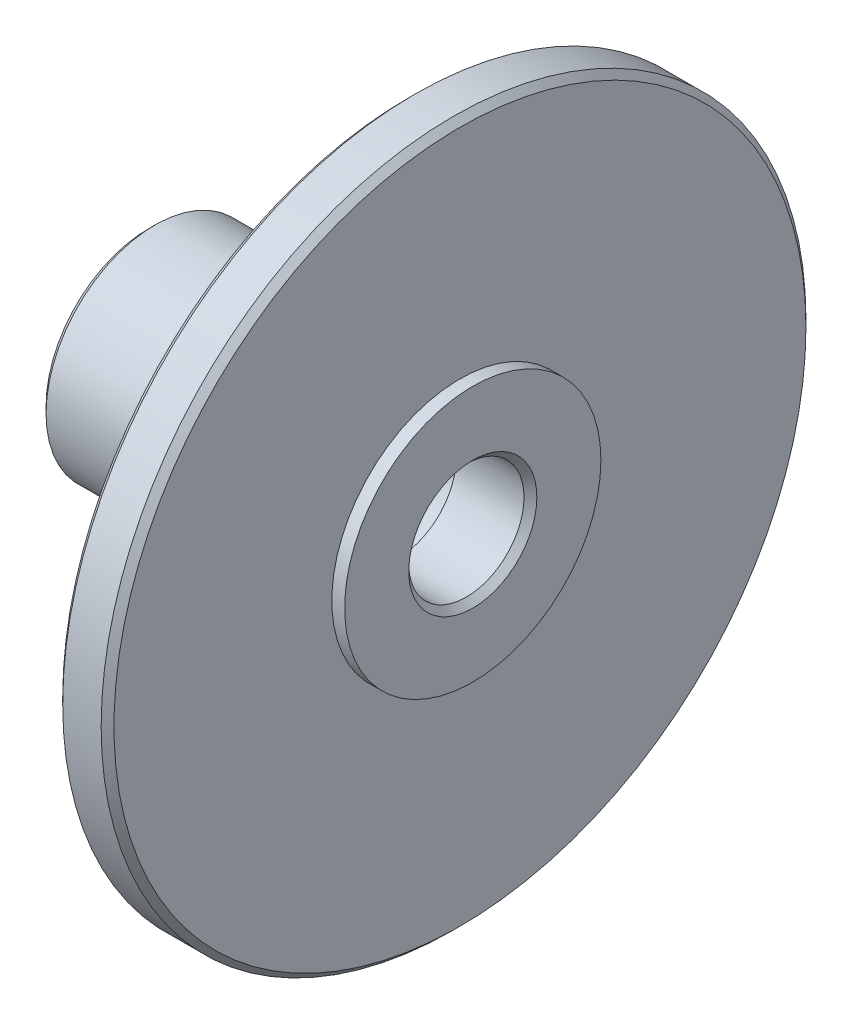
ISO-10303-21;
HEADER;
FILE_DESCRIPTION(('STEP AP214'),'2;1');
FILE_NAME('part.step','',(''),(''),'','','');
FILE_SCHEMA(('AUTOMOTIVE_DESIGN { 1 0 10303 214 1 1 1 1 }'));
ENDSEC;
DATA;
#1=APPLICATION_CONTEXT('core data for automotive mechanical design processes');
#2=APPLICATION_PROTOCOL_DEFINITION('international standard','automotive_design',2000,#1);
#3=PRODUCT_CONTEXT('',#1,'mechanical');
#4=PRODUCT('Part','Part','',(#3));
#5=PRODUCT_RELATED_PRODUCT_CATEGORY('part','',(#4));
#6=PRODUCT_DEFINITION_FORMATION('','',#4);
#7=PRODUCT_DEFINITION_CONTEXT('part definition',#1,'design');
#8=PRODUCT_DEFINITION('design','',#6,#7);
#9=PRODUCT_DEFINITION_SHAPE('','',#8);
#10=(LENGTH_UNIT() NAMED_UNIT(*) SI_UNIT(.MILLI.,.METRE.));
#11=(NAMED_UNIT(*) PLANE_ANGLE_UNIT() SI_UNIT($,.RADIAN.));
#12=(NAMED_UNIT(*) SI_UNIT($,.STERADIAN.) SOLID_ANGLE_UNIT());
#13=UNCERTAINTY_MEASURE_WITH_UNIT(LENGTH_MEASURE(1.E-05),#10,'distance_accuracy_value','');
#14=(GEOMETRIC_REPRESENTATION_CONTEXT(3) GLOBAL_UNCERTAINTY_ASSIGNED_CONTEXT((#13)) GLOBAL_UNIT_ASSIGNED_CONTEXT((#10,
#11,#12)) REPRESENTATION_CONTEXT('',''));
#15=CARTESIAN_POINT('',(0.,0.,0.));
#16=DIRECTION('',(0.,0.,1.));
#17=DIRECTION('',(1.,0.,0.));
#18=AXIS2_PLACEMENT_3D('',#15,#16,#17);
#19=CARTESIAN_POINT('',(184.6,-26.5,216.5));
#20=DIRECTION('',(-1.,0.,0.));
#21=DIRECTION('',(0.,0.,1.));
#22=AXIS2_PLACEMENT_3D('',#19,#20,#21);
#23=CYLINDRICAL_SURFACE('',#22,27.5);
#24=CARTESIAN_POINT('',(184.099999999998,-26.5,216.5));
#25=DIRECTION('',(1.,0.,0.));
#26=DIRECTION('',(0.,0.,-1.));
#27=AXIS2_PLACEMENT_3D('',#24,#25,#26);
#28=CIRCLE('',#27,27.5);
#29=CARTESIAN_POINT('',(184.099999999998,-26.5,189.));
#30=VERTEX_POINT('',#29);
#31=EDGE_CURVE('E313',#30,#30,#28,.F.);
#32=ORIENTED_EDGE('',*,*,#31,.T.);
#33=EDGE_LOOP('',(#32));
#34=FACE_BOUND('',#33,.T.);
#35=CARTESIAN_POINT('',(181.100000000002,-26.5,216.5));
#36=DIRECTION('',(-1.,0.,0.));
#37=DIRECTION('',(0.,0.,1.));
#38=AXIS2_PLACEMENT_3D('',#35,#36,#37);
#39=CIRCLE('',#38,27.5);
#40=CARTESIAN_POINT('',(181.100000000002,-26.5,244.));
#41=VERTEX_POINT('',#40);
#42=EDGE_CURVE('E144',#41,#41,#39,.F.);
#43=ORIENTED_EDGE('',*,*,#42,.T.);
#44=EDGE_LOOP('',(#43));
#45=FACE_BOUND('',#44,.T.);
#46=ADVANCED_FACE('F41',(#34,#45),#23,.T.);
#47=CARTESIAN_POINT('',(184.6,1.,216.5));
#48=DIRECTION('',(1.,0.,0.));
#49=DIRECTION('',(0.,0.,-1.));
#50=AXIS2_PLACEMENT_3D('',#47,#48,#49);
#51=PLANE('',#50);
#52=CARTESIAN_POINT('',(184.6,-26.5,216.5));
#53=DIRECTION('',(1.,0.,0.));
#54=DIRECTION('',(0.,0.,-1.));
#55=AXIS2_PLACEMENT_3D('',#52,#53,#54);
#56=CIRCLE('',#55,26.9999999999984);
#57=CARTESIAN_POINT('',(184.6,-26.5,189.500000000002));
#58=VERTEX_POINT('',#57);
#59=EDGE_CURVE('E316',#58,#58,#56,.T.);
#60=ORIENTED_EDGE('',*,*,#59,.T.);
#61=EDGE_LOOP('',(#60));
#62=FACE_BOUND('',#61,.T.);
#63=CARTESIAN_POINT('',(184.6,-26.5,216.5));
#64=DIRECTION('',(1.,0.,0.));
#65=DIRECTION('',(0.,0.,-1.));
#66=AXIS2_PLACEMENT_3D('',#63,#64,#65);
#67=CIRCLE('',#66,10.);
#68=CARTESIAN_POINT('',(184.6,-26.5,206.5));
#69=VERTEX_POINT('',#68);
#70=EDGE_CURVE('E297',#69,#69,#67,.T.);
#71=ORIENTED_EDGE('',*,*,#70,.F.);
#72=EDGE_LOOP('',(#71));
#73=FACE_BOUND('',#72,.T.);
#74=ADVANCED_FACE('F202',(#62,#73),#51,.T.);
#75=CARTESIAN_POINT('',(180.6,-26.5,216.5));
#76=DIRECTION('',(-1.,0.,0.));
#77=DIRECTION('',(0.,0.,1.));
#78=AXIS2_PLACEMENT_3D('',#75,#76,#77);
#79=PLANE('',#78);
#80=CARTESIAN_POINT('',(180.6,-26.5,216.5));
#81=DIRECTION('',(-1.,0.,0.));
#82=DIRECTION('',(0.,0.,1.));
#83=AXIS2_PLACEMENT_3D('',#80,#81,#82);
#84=CIRCLE('',#83,13.5);
#85=CARTESIAN_POINT('',(180.6,-26.5,230.));
#86=VERTEX_POINT('',#85);
#87=EDGE_CURVE('E11',#86,#86,#84,.F.);
#88=ORIENTED_EDGE('',*,*,#87,.T.);
#89=EDGE_LOOP('',(#88));
#90=FACE_BOUND('',#89,.T.);
#91=CARTESIAN_POINT('',(180.6,-26.5,216.5));
#92=DIRECTION('',(-1.,0.,0.));
#93=DIRECTION('',(0.,0.,1.));
#94=AXIS2_PLACEMENT_3D('',#91,#92,#93);
#95=CIRCLE('',#94,26.9999999999984);
#96=CARTESIAN_POINT('',(180.6,-26.5,243.499999999998));
#97=VERTEX_POINT('',#96);
#98=EDGE_CURVE('E328',#97,#97,#95,.T.);
#99=ORIENTED_EDGE('',*,*,#98,.T.);
#100=EDGE_LOOP('',(#99));
#101=FACE_BOUND('',#100,.T.);
#102=ADVANCED_FACE('F208',(#90,#101),#79,.T.);
#103=CARTESIAN_POINT('',(185.6,-26.5,216.5));
#104=DIRECTION('',(-1.,0.,0.));
#105=DIRECTION('',(0.,0.,1.));
#106=AXIS2_PLACEMENT_3D('',#103,#104,#105);
#107=CYLINDRICAL_SURFACE('',#106,10.);
#108=CARTESIAN_POINT('',(185.6,-26.5,216.5));
#109=DIRECTION('',(1.,0.,0.));
#110=DIRECTION('',(0.,0.,-1.));
#111=AXIS2_PLACEMENT_3D('',#108,#109,#110);
#112=CIRCLE('',#111,10.);
#113=CARTESIAN_POINT('',(185.6,-26.5,206.5));
#114=VERTEX_POINT('',#113);
#115=EDGE_CURVE('E301',#114,#114,#112,.T.);
#116=ORIENTED_EDGE('',*,*,#115,.F.);
#117=EDGE_LOOP('',(#116));
#118=FACE_BOUND('',#117,.T.);
#119=ORIENTED_EDGE('',*,*,#70,.T.);
#120=EDGE_LOOP('',(#119));
#121=FACE_BOUND('',#120,.T.);
#122=ADVANCED_FACE('F393',(#118,#121),#107,.T.);
#123=CARTESIAN_POINT('',(185.6,-26.5,216.5));
#124=DIRECTION('',(1.,0.,0.));
#125=DIRECTION('',(0.,0.,-1.));
#126=AXIS2_PLACEMENT_3D('',#123,#124,#125);
#127=PLANE('',#126);
#128=CARTESIAN_POINT('',(185.6,-26.5,216.5));
#129=DIRECTION('',(1.,0.,0.));
#130=DIRECTION('',(0.,0.,-1.));
#131=AXIS2_PLACEMENT_3D('',#128,#129,#130);
#132=CIRCLE('',#131,5.00000000000161);
#133=CARTESIAN_POINT('',(185.6,-26.5,211.499999999998));
#134=VERTEX_POINT('',#133);
#135=EDGE_CURVE('E324',#134,#134,#132,.F.);
#136=ORIENTED_EDGE('',*,*,#135,.T.);
#137=EDGE_LOOP('',(#136));
#138=FACE_BOUND('',#137,.T.);
#139=ORIENTED_EDGE('',*,*,#115,.T.);
#140=EDGE_LOOP('',(#139));
#141=FACE_BOUND('',#140,.T.);
#142=ADVANCED_FACE('F390',(#138,#141),#127,.T.);
#143=CARTESIAN_POINT('',(172.5,-26.5,216.5));
#144=DIRECTION('',(1.,0.,0.));
#145=DIRECTION('',(0.,0.,-1.));
#146=AXIS2_PLACEMENT_3D('',#143,#144,#145);
#147=CYLINDRICAL_SURFACE('',#146,9.50000000000001);
#148=CARTESIAN_POINT('',(176.6,-26.5,216.5));
#149=DIRECTION('',(-1.,0.,0.));
#150=DIRECTION('',(0.,0.,1.));
#151=AXIS2_PLACEMENT_3D('',#148,#149,#150);
#152=CIRCLE('',#151,9.50000000000001);
#153=CARTESIAN_POINT('',(176.6,-26.5,226.));
#154=VERTEX_POINT('',#153);
#155=EDGE_CURVE('E50',#154,#154,#152,.T.);
#156=ORIENTED_EDGE('',*,*,#155,.T.);
#157=EDGE_LOOP('',(#156));
#158=FACE_BOUND('',#157,.T.);
#159=CARTESIAN_POINT('',(172.5,-26.5,216.5));
#160=DIRECTION('',(-1.,0.,0.));
#161=DIRECTION('',(0.,0.,1.));
#162=AXIS2_PLACEMENT_3D('',#159,#160,#161);
#163=CIRCLE('',#162,9.50000000000001);
#164=CARTESIAN_POINT('',(172.5,-26.5,226.));
#165=VERTEX_POINT('',#164);
#166=EDGE_CURVE('E275',#165,#165,#163,.T.);
#167=ORIENTED_EDGE('',*,*,#166,.F.);
#168=EDGE_LOOP('',(#167));
#169=FACE_BOUND('',#168,.T.);
#170=ADVANCED_FACE('F189',(#158,#169),#147,.T.);
#171=CARTESIAN_POINT('',(172.5,-26.5,216.5));
#172=DIRECTION('',(-1.,0.,0.));
#173=DIRECTION('',(0.,0.,1.));
#174=AXIS2_PLACEMENT_3D('',#171,#172,#173);
#175=PLANE('',#174);
#176=CARTESIAN_POINT('',(172.5,-26.5,216.5));
#177=DIRECTION('',(-1.,0.,0.));
#178=DIRECTION('',(0.,0.,1.));
#179=AXIS2_PLACEMENT_3D('',#176,#177,#178);
#180=CIRCLE('',#179,8.49999999999999);
#181=CARTESIAN_POINT('',(172.5,-26.5,225.));
#182=VERTEX_POINT('',#181);
#183=EDGE_CURVE('E293',#182,#182,#180,.T.);
#184=ORIENTED_EDGE('',*,*,#183,.F.);
#185=EDGE_LOOP('',(#184));
#186=FACE_BOUND('',#185,.T.);
#187=ORIENTED_EDGE('',*,*,#166,.T.);
#188=EDGE_LOOP('',(#187));
#189=FACE_BOUND('',#188,.T.);
#190=ADVANCED_FACE('F380',(#186,#189),#175,.T.);
#191=CARTESIAN_POINT('',(160.3,-26.5,216.5));
#192=DIRECTION('',(1.,0.,0.));
#193=DIRECTION('',(0.,0.,-1.));
#194=AXIS2_PLACEMENT_3D('',#191,#192,#193);
#195=CYLINDRICAL_SURFACE('',#194,8.49999999999999);
#196=CARTESIAN_POINT('',(160.800000000002,-26.5,216.5));
#197=DIRECTION('',(-1.,0.,0.));
#198=DIRECTION('',(0.,0.,1.));
#199=AXIS2_PLACEMENT_3D('',#196,#197,#198);
#200=CIRCLE('',#199,8.49999999999999);
#201=CARTESIAN_POINT('',(160.800000000002,-26.5,225.));
#202=VERTEX_POINT('',#201);
#203=EDGE_CURVE('E134',#202,#202,#200,.F.);
#204=ORIENTED_EDGE('',*,*,#203,.T.);
#205=EDGE_LOOP('',(#204));
#206=FACE_BOUND('',#205,.T.);
#207=ORIENTED_EDGE('',*,*,#183,.T.);
#208=EDGE_LOOP('',(#207));
#209=FACE_BOUND('',#208,.T.);
#210=ADVANCED_FACE('F372',(#206,#209),#195,.T.);
#211=CARTESIAN_POINT('',(160.3,-26.5,216.5));
#212=DIRECTION('',(-1.,0.,0.));
#213=DIRECTION('',(0.,0.,1.));
#214=AXIS2_PLACEMENT_3D('',#211,#212,#213);
#215=PLANE('',#214);
#216=CARTESIAN_POINT('',(160.3,-26.5,216.5));
#217=DIRECTION('',(-1.,0.,0.));
#218=DIRECTION('',(0.,0.,1.));
#219=AXIS2_PLACEMENT_3D('',#216,#217,#218);
#220=CIRCLE('',#219,7.99999999999837);
#221=CARTESIAN_POINT('',(160.3,-26.5,224.499999999998));
#222=VERTEX_POINT('',#221);
#223=EDGE_CURVE('E332',#222,#222,#220,.T.);
#224=ORIENTED_EDGE('',*,*,#223,.T.);
#225=EDGE_LOOP('',(#224));
#226=FACE_BOUND('',#225,.T.);
#227=DIRECTION('',(0.,0.707106781186498,-0.707106781186597));
#228=VECTOR('',#227,1.);
#229=CARTESIAN_POINT('',(160.3,-25.2492286871601,220.906082936653));
#230=LINE('',#229,#228);
#231=CARTESIAN_POINT('',(160.3,-24.9196621947679,220.57651644426));
#232=VERTEX_POINT('',#231);
#233=CARTESIAN_POINT('',(160.3,-22.4234835557392,218.080337805231));
#234=VERTEX_POINT('',#233);
#235=EDGE_CURVE('E129',#232,#234,#230,.T.);
#236=ORIENTED_EDGE('',*,*,#235,.F.);
#237=CARTESIAN_POINT('',(160.3,-24.2125554135813,221.283623225447));
#238=DIRECTION('',(-1.,0.,0.));
#239=DIRECTION('',(0.,0.,1.));
#240=AXIS2_PLACEMENT_3D('',#237,#238,#239);
#241=CIRCLE('',#240,1.);
#242=CARTESIAN_POINT('',(160.3,-25.212386061891,221.265220108848));
#243=VERTEX_POINT('',#242);
#244=EDGE_CURVE('E350',#232,#243,#241,.T.);
#245=ORIENTED_EDGE('',*,*,#244,.T.);
#246=CARTESIAN_POINT('',(160.3,-26.7121320343556,221.23761543395));
#247=DIRECTION('',(-1.,0.,0.));
#248=DIRECTION('',(0.,0.,1.));
#249=AXIS2_PLACEMENT_3D('',#246,#247,#248);
#250=CIRCLE('',#249,1.5);
#251=CARTESIAN_POINT('',(160.3,-28.1592083672621,221.632545917379));
#252=VERTEX_POINT('',#251);
#253=EDGE_CURVE('E284',#252,#243,#250,.T.);
#254=ORIENTED_EDGE('',*,*,#253,.F.);
#255=CARTESIAN_POINT('',(160.3,-29.1239259225332,221.895832906332));
#256=DIRECTION('',(-1.,0.,0.));
#257=DIRECTION('',(0.,0.,1.));
#258=AXIS2_PLACEMENT_3D('',#255,#256,#257);
#259=CIRCLE('',#258,1.);
#260=CARTESIAN_POINT('',(160.3,-28.6866049354443,220.996527421944));
#261=VERTEX_POINT('',#260);
#262=EDGE_CURVE('E344',#252,#261,#259,.T.);
#263=ORIENTED_EDGE('',*,*,#262,.T.);
#264=CARTESIAN_POINT('',(160.3,-26.5,216.5));
#265=DIRECTION('',(-1.,0.,0.));
#266=DIRECTION('',(0.,0.,1.));
#267=AXIS2_PLACEMENT_3D('',#264,#265,#266);
#268=CIRCLE('',#267,5.00000000000001);
#269=CARTESIAN_POINT('',(160.3,-22.0034725780568,214.313395064555));
#270=VERTEX_POINT('',#269);
#271=EDGE_CURVE('E281',#270,#261,#268,.T.);
#272=ORIENTED_EDGE('',*,*,#271,.F.);
#273=CARTESIAN_POINT('',(160.3,-21.1041670936682,213.876074077466));
#274=DIRECTION('',(-1.,0.,0.));
#275=DIRECTION('',(0.,0.,1.));
#276=AXIS2_PLACEMENT_3D('',#273,#274,#275);
#277=CIRCLE('',#276,1.);
#278=CARTESIAN_POINT('',(160.3,-21.367454082621,214.840791632737));
#279=VERTEX_POINT('',#278);
#280=EDGE_CURVE('E341',#270,#279,#277,.T.);
#281=ORIENTED_EDGE('',*,*,#280,.T.);
#282=CARTESIAN_POINT('',(160.3,-21.7623845660502,216.287867965643));
#283=DIRECTION('',(-1.,0.,0.));
#284=DIRECTION('',(0.,0.,1.));
#285=AXIS2_PLACEMENT_3D('',#282,#283,#284);
#286=CIRCLE('',#285,1.49999999999999);
#287=CARTESIAN_POINT('',(160.3,-21.7347798911516,217.787613938108));
#288=VERTEX_POINT('',#287);
#289=EDGE_CURVE('E277',#288,#279,#286,.T.);
#290=ORIENTED_EDGE('',*,*,#289,.F.);
#291=CARTESIAN_POINT('',(160.3,-21.7163767745526,218.787444586418));
#292=DIRECTION('',(-1.,0.,0.));
#293=DIRECTION('',(0.,0.,1.));
#294=AXIS2_PLACEMENT_3D('',#291,#292,#293);
#295=CIRCLE('',#294,1.);
#296=EDGE_CURVE('E347',#288,#234,#295,.T.);
#297=ORIENTED_EDGE('',*,*,#296,.T.);
#298=EDGE_LOOP('',(#236,#245,#254,#263,#272,#281,#290,#297));
#299=FACE_BOUND('',#298,.T.);
#300=ADVANCED_FACE('F368',(#226,#299),#215,.T.);
#301=CARTESIAN_POINT('',(179.8,-26.5,216.5));
#302=DIRECTION('',(-1.,0.,0.));
#303=DIRECTION('',(0.,0.,1.));
#304=AXIS2_PLACEMENT_3D('',#301,#302,#303);
#305=CYLINDRICAL_SURFACE('',#304,5.00000000000001);
#306=ORIENTED_EDGE('',*,*,#271,.T.);
#307=DIRECTION('',(-1.,0.,0.));
#308=VECTOR('',#307,1.);
#309=CARTESIAN_POINT('',(179.8,-28.6866049354443,220.996527421944));
#310=LINE('',#309,#308);
#311=CARTESIAN_POINT('',(179.8,-28.6866049354443,220.996527421944));
#312=VERTEX_POINT('',#311);
#313=EDGE_CURVE('E57',#261,#312,#310,.F.);
#314=ORIENTED_EDGE('',*,*,#313,.T.);
#315=CARTESIAN_POINT('',(179.8,-26.5,216.5));
#316=DIRECTION('',(-1.,0.,0.));
#317=DIRECTION('',(0.,0.,1.));
#318=AXIS2_PLACEMENT_3D('',#315,#316,#317);
#319=CIRCLE('',#318,5.00000000000001);
#320=CARTESIAN_POINT('',(179.8,-22.0034725780568,214.313395064555));
#321=VERTEX_POINT('',#320);
#322=EDGE_CURVE('E263',#321,#312,#319,.T.);
#323=ORIENTED_EDGE('',*,*,#322,.F.);
#324=DIRECTION('',(-1.,0.,0.));
#325=VECTOR('',#324,1.);
#326=CARTESIAN_POINT('',(179.8,-22.0034725780568,214.313395064555));
#327=LINE('',#326,#325);
#328=EDGE_CURVE('E168',#321,#270,#327,.T.);
#329=ORIENTED_EDGE('',*,*,#328,.T.);
#330=EDGE_LOOP('',(#306,#314,#323,#329));
#331=FACE_BOUND('',#330,.T.);
#332=ADVANCED_FACE('F366',(#331),#305,.F.);
#333=CARTESIAN_POINT('',(179.8,-21.7623845660502,216.287867965643));
#334=DIRECTION('',(-1.,0.,0.));
#335=DIRECTION('',(0.,0.,1.));
#336=AXIS2_PLACEMENT_3D('',#333,#334,#335);
#337=CYLINDRICAL_SURFACE('',#336,1.49999999999999);
#338=CARTESIAN_POINT('',(179.8,-21.7623845660502,216.287867965643));
#339=DIRECTION('',(-1.,0.,0.));
#340=DIRECTION('',(0.,0.,1.));
#341=AXIS2_PLACEMENT_3D('',#338,#339,#340);
#342=CIRCLE('',#341,1.49999999999999);
#343=CARTESIAN_POINT('',(179.8,-21.7347798911516,217.787613938108));
#344=VERTEX_POINT('',#343);
#345=CARTESIAN_POINT('',(179.8,-21.367454082621,214.840791632737));
#346=VERTEX_POINT('',#345);
#347=EDGE_CURVE('E271',#344,#346,#342,.T.);
#348=ORIENTED_EDGE('',*,*,#347,.F.);
#349=DIRECTION('',(-1.,0.,0.));
#350=VECTOR('',#349,1.);
#351=CARTESIAN_POINT('',(179.8,-21.7347798911516,217.787613938108));
#352=LINE('',#351,#350);
#353=EDGE_CURVE('E164',#344,#288,#352,.T.);
#354=ORIENTED_EDGE('',*,*,#353,.T.);
#355=ORIENTED_EDGE('',*,*,#289,.T.);
#356=DIRECTION('',(-1.,0.,0.));
#357=VECTOR('',#356,1.);
#358=CARTESIAN_POINT('',(179.8,-21.367454082621,214.840791632737));
#359=LINE('',#358,#357);
#360=EDGE_CURVE('E157',#279,#346,#359,.F.);
#361=ORIENTED_EDGE('',*,*,#360,.T.);
#362=EDGE_LOOP('',(#348,#354,#355,#361));
#363=FACE_BOUND('',#362,.T.);
#364=ADVANCED_FACE('F361',(#363),#337,.F.);
#365=CARTESIAN_POINT('',(179.8,-25.2492286871601,220.906082936653));
#366=DIRECTION('',(0.,0.707106781186597,0.707106781186498));
#367=DIRECTION('',(0.,-0.707106781186498,0.707106781186597));
#368=AXIS2_PLACEMENT_3D('',#365,#366,#367);
#369=PLANE('',#368);
#370=DIRECTION('',(0.,-0.707106781186498,0.707106781186597));
#371=VECTOR('',#370,1.);
#372=CARTESIAN_POINT('',(175.6,-25.2492286871601,220.906082936653));
#373=LINE('',#372,#371);
#374=CARTESIAN_POINT('',(175.6,-22.4234835557392,218.080337805231));
#375=VERTEX_POINT('',#374);
#376=CARTESIAN_POINT('',(175.6,-24.9196621947679,220.57651644426));
#377=VERTEX_POINT('',#376);
#378=EDGE_CURVE('E126',#375,#377,#373,.T.);
#379=ORIENTED_EDGE('',*,*,#378,.T.);
#380=DIRECTION('',(-1.,0.,0.));
#381=VECTOR('',#380,1.);
#382=CARTESIAN_POINT('',(179.8,-24.9196621947679,220.57651644426));
#383=LINE('',#382,#381);
#384=EDGE_CURVE('E133',#377,#232,#383,.T.);
#385=ORIENTED_EDGE('',*,*,#384,.T.);
#386=ORIENTED_EDGE('',*,*,#235,.T.);
#387=DIRECTION('',(-1.,0.,0.));
#388=VECTOR('',#387,1.);
#389=CARTESIAN_POINT('',(179.8,-22.4234835557392,218.080337805231));
#390=LINE('',#389,#388);
#391=EDGE_CURVE('E122',#234,#375,#390,.F.);
#392=ORIENTED_EDGE('',*,*,#391,.T.);
#393=EDGE_LOOP('',(#379,#385,#386,#392));
#394=FACE_BOUND('',#393,.T.);
#395=ADVANCED_FACE('F124',(#394),#369,.F.);
#396=CARTESIAN_POINT('',(179.8,-26.7121320343556,221.23761543395));
#397=DIRECTION('',(-1.,0.,0.));
#398=DIRECTION('',(0.,0.,1.));
#399=AXIS2_PLACEMENT_3D('',#396,#397,#398);
#400=CYLINDRICAL_SURFACE('',#399,1.5);
#401=ORIENTED_EDGE('',*,*,#253,.T.);
#402=DIRECTION('',(-1.,0.,0.));
#403=VECTOR('',#402,1.);
#404=CARTESIAN_POINT('',(179.8,-25.212386061891,221.265220108848));
#405=LINE('',#404,#403);
#406=CARTESIAN_POINT('',(179.8,-25.212386061891,221.265220108848));
#407=VERTEX_POINT('',#406);
#408=EDGE_CURVE('E269',#243,#407,#405,.F.);
#409=ORIENTED_EDGE('',*,*,#408,.T.);
#410=CARTESIAN_POINT('',(179.8,-26.7121320343556,221.23761543395));
#411=DIRECTION('',(-1.,0.,0.));
#412=DIRECTION('',(0.,0.,1.));
#413=AXIS2_PLACEMENT_3D('',#410,#411,#412);
#414=CIRCLE('',#413,1.5);
#415=CARTESIAN_POINT('',(179.8,-28.1592083672621,221.632545917379));
#416=VERTEX_POINT('',#415);
#417=EDGE_CURVE('E261',#416,#407,#414,.T.);
#418=ORIENTED_EDGE('',*,*,#417,.F.);
#419=DIRECTION('',(-1.,0.,0.));
#420=VECTOR('',#419,1.);
#421=CARTESIAN_POINT('',(179.8,-28.1592083672621,221.632545917379));
#422=LINE('',#421,#420);
#423=EDGE_CURVE('E257',#416,#252,#422,.T.);
#424=ORIENTED_EDGE('',*,*,#423,.T.);
#425=EDGE_LOOP('',(#401,#409,#418,#424));
#426=FACE_BOUND('',#425,.T.);
#427=ADVANCED_FACE('F266',(#426),#400,.F.);
#428=CARTESIAN_POINT('',(179.8,-26.5,216.5));
#429=DIRECTION('',(-1.,0.,0.));
#430=DIRECTION('',(0.,0.,1.));
#431=AXIS2_PLACEMENT_3D('',#428,#429,#430);
#432=PLANE('',#431);
#433=CARTESIAN_POINT('',(179.8,-26.5,216.5));
#434=DIRECTION('',(-1.,0.,0.));
#435=DIRECTION('',(0.,0.,1.));
#436=AXIS2_PLACEMENT_3D('',#433,#434,#435);
#437=CIRCLE('',#436,4.50000000000001);
#438=CARTESIAN_POINT('',(179.8,-22.2338397223544,217.931738972522));
#439=VERTEX_POINT('',#438);
#440=CARTESIAN_POINT('',(179.8,-25.068261027477,220.766160277645));
#441=VERTEX_POINT('',#440);
#442=EDGE_CURVE('E145',#439,#441,#437,.T.);
#443=ORIENTED_EDGE('',*,*,#442,.F.);
#444=CARTESIAN_POINT('',(179.8,-21.7163767745526,218.787444586418));
#445=DIRECTION('',(-1.,0.,0.));
#446=DIRECTION('',(0.,0.,1.));
#447=AXIS2_PLACEMENT_3D('',#444,#445,#446);
#448=CIRCLE('',#447,1.);
#449=EDGE_CURVE('E178',#439,#344,#448,.F.);
#450=ORIENTED_EDGE('',*,*,#449,.T.);
#451=ORIENTED_EDGE('',*,*,#347,.T.);
#452=CARTESIAN_POINT('',(179.8,-21.1041670936682,213.876074077466));
#453=DIRECTION('',(-1.,0.,0.));
#454=DIRECTION('',(0.,0.,1.));
#455=AXIS2_PLACEMENT_3D('',#452,#453,#454);
#456=CIRCLE('',#455,1.);
#457=EDGE_CURVE('E64',#346,#321,#456,.F.);
#458=ORIENTED_EDGE('',*,*,#457,.T.);
#459=ORIENTED_EDGE('',*,*,#322,.T.);
#460=CARTESIAN_POINT('',(179.8,-29.1239259225332,221.895832906332));
#461=DIRECTION('',(-1.,0.,0.));
#462=DIRECTION('',(0.,0.,1.));
#463=AXIS2_PLACEMENT_3D('',#460,#461,#462);
#464=CIRCLE('',#463,1.);
#465=EDGE_CURVE('E181',#312,#416,#464,.F.);
#466=ORIENTED_EDGE('',*,*,#465,.T.);
#467=ORIENTED_EDGE('',*,*,#417,.T.);
#468=CARTESIAN_POINT('',(179.8,-24.2125554135813,221.283623225447));
#469=DIRECTION('',(-1.,0.,0.));
#470=DIRECTION('',(0.,0.,1.));
#471=AXIS2_PLACEMENT_3D('',#468,#469,#470);
#472=CIRCLE('',#471,1.);
#473=EDGE_CURVE('E174',#407,#441,#472,.F.);
#474=ORIENTED_EDGE('',*,*,#473,.T.);
#475=EDGE_LOOP('',(#443,#450,#451,#458,#459,#466,#467,#474));
#476=FACE_BOUND('',#475,.T.);
#477=ADVANCED_FACE('F260',(#476),#432,.T.);
#478=CARTESIAN_POINT('',(175.6,-24.,216.5));
#479=DIRECTION('',(-1.,0.,0.));
#480=DIRECTION('',(0.,0.,1.));
#481=AXIS2_PLACEMENT_3D('',#478,#479,#480);
#482=PLANE('',#481);
#483=CARTESIAN_POINT('',(175.6,-26.5,216.5));
#484=DIRECTION('',(1.,0.,0.));
#485=DIRECTION('',(0.,0.,-1.));
#486=AXIS2_PLACEMENT_3D('',#483,#484,#485);
#487=CIRCLE('',#486,4.50000000000001);
#488=CARTESIAN_POINT('',(175.6,-22.2338397223544,217.931738972522));
#489=VERTEX_POINT('',#488);
#490=CARTESIAN_POINT('',(175.6,-25.068261027477,220.766160277645));
#491=VERTEX_POINT('',#490);
#492=EDGE_CURVE('E285',#489,#491,#487,.T.);
#493=ORIENTED_EDGE('',*,*,#492,.T.);
#494=CARTESIAN_POINT('',(175.6,-24.2125554135813,221.283623225447));
#495=DIRECTION('',(-1.,0.,0.));
#496=DIRECTION('',(0.,0.,1.));
#497=AXIS2_PLACEMENT_3D('',#494,#495,#496);
#498=CIRCLE('',#497,1.);
#499=EDGE_CURVE('E142',#491,#377,#498,.F.);
#500=ORIENTED_EDGE('',*,*,#499,.T.);
#501=ORIENTED_EDGE('',*,*,#378,.F.);
#502=CARTESIAN_POINT('',(175.6,-21.7163767745526,218.787444586418));
#503=DIRECTION('',(-1.,0.,0.));
#504=DIRECTION('',(0.,0.,1.));
#505=AXIS2_PLACEMENT_3D('',#502,#503,#504);
#506=CIRCLE('',#505,1.);
#507=EDGE_CURVE('E139',#375,#489,#506,.F.);
#508=ORIENTED_EDGE('',*,*,#507,.T.);
#509=EDGE_LOOP('',(#493,#500,#501,#508));
#510=FACE_BOUND('',#509,.T.);
#511=ADVANCED_FACE('F138',(#510),#482,.F.);
#512=CARTESIAN_POINT('',(185.6,-26.5,216.5));
#513=DIRECTION('',(1.,0.,0.));
#514=DIRECTION('',(0.,0.,-1.));
#515=AXIS2_PLACEMENT_3D('',#512,#513,#514);
#516=CYLINDRICAL_SURFACE('',#515,4.50000000000001);
#517=CARTESIAN_POINT('',(185.099999999998,-26.5,216.5));
#518=DIRECTION('',(1.,0.,0.));
#519=DIRECTION('',(0.,0.,-1.));
#520=AXIS2_PLACEMENT_3D('',#517,#518,#519);
#521=CIRCLE('',#520,4.50000000000001);
#522=CARTESIAN_POINT('',(185.099999999998,-26.5,212.));
#523=VERTEX_POINT('',#522);
#524=EDGE_CURVE('E320',#523,#523,#521,.T.);
#525=ORIENTED_EDGE('',*,*,#524,.T.);
#526=EDGE_LOOP('',(#525));
#527=FACE_BOUND('',#526,.T.);
#528=ORIENTED_EDGE('',*,*,#442,.T.);
#529=DIRECTION('',(1.,0.,0.));
#530=VECTOR('',#529,1.);
#531=CARTESIAN_POINT('',(179.8,-25.068261027477,220.766160277645));
#532=LINE('',#531,#530);
#533=EDGE_CURVE('E153',#441,#491,#532,.F.);
#534=ORIENTED_EDGE('',*,*,#533,.T.);
#535=ORIENTED_EDGE('',*,*,#492,.F.);
#536=DIRECTION('',(1.,0.,0.));
#537=VECTOR('',#536,1.);
#538=CARTESIAN_POINT('',(175.6,-22.2338397223544,217.931738972522));
#539=LINE('',#538,#537);
#540=EDGE_CURVE('E151',#489,#439,#539,.T.);
#541=ORIENTED_EDGE('',*,*,#540,.T.);
#542=EDGE_LOOP('',(#528,#534,#535,#541));
#543=FACE_BOUND('',#542,.T.);
#544=ADVANCED_FACE('F223',(#527,#543),#516,.F.);
#545=CARTESIAN_POINT('',(184.099999999998,-26.5,216.5));
#546=DIRECTION('',(-1.,0.,0.));
#547=DIRECTION('',(0.,0.,1.));
#548=AXIS2_PLACEMENT_3D('',#545,#546,#547);
#549=CONICAL_SURFACE('',#548,27.5,0.785398163397452);
#550=ORIENTED_EDGE('',*,*,#59,.F.);
#551=EDGE_LOOP('',(#550));
#552=FACE_BOUND('',#551,.T.);
#553=ORIENTED_EDGE('',*,*,#31,.F.);
#554=EDGE_LOOP('',(#553));
#555=FACE_BOUND('',#554,.T.);
#556=ADVANCED_FACE('F216',(#552,#555),#549,.T.);
#557=CARTESIAN_POINT('',(185.099999999998,-26.5,216.5));
#558=DIRECTION('',(1.,0.,0.));
#559=DIRECTION('',(0.,0.,-1.));
#560=AXIS2_PLACEMENT_3D('',#557,#558,#559);
#561=CONICAL_SURFACE('',#560,4.50000000000001,0.785398163397438);
#562=ORIENTED_EDGE('',*,*,#135,.F.);
#563=EDGE_LOOP('',(#562));
#564=FACE_BOUND('',#563,.T.);
#565=ORIENTED_EDGE('',*,*,#524,.F.);
#566=EDGE_LOOP('',(#565));
#567=FACE_BOUND('',#566,.T.);
#568=ADVANCED_FACE('F222',(#564,#567),#561,.F.);
#569=CARTESIAN_POINT('',(180.6,-26.5,216.5));
#570=DIRECTION('',(1.,0.,0.));
#571=DIRECTION('',(0.,0.,-1.));
#572=AXIS2_PLACEMENT_3D('',#569,#570,#571);
#573=CONICAL_SURFACE('',#572,26.9999999999984,0.785398163397452);
#574=ORIENTED_EDGE('',*,*,#42,.F.);
#575=EDGE_LOOP('',(#574));
#576=FACE_BOUND('',#575,.T.);
#577=ORIENTED_EDGE('',*,*,#98,.F.);
#578=EDGE_LOOP('',(#577));
#579=FACE_BOUND('',#578,.T.);
#580=ADVANCED_FACE('F230',(#576,#579),#573,.T.);
#581=CARTESIAN_POINT('',(160.3,-26.5,216.5));
#582=DIRECTION('',(1.,0.,0.));
#583=DIRECTION('',(0.,0.,-1.));
#584=AXIS2_PLACEMENT_3D('',#581,#582,#583);
#585=CONICAL_SURFACE('',#584,7.99999999999837,0.785398163397488);
#586=ORIENTED_EDGE('',*,*,#203,.F.);
#587=EDGE_LOOP('',(#586));
#588=FACE_BOUND('',#587,.T.);
#589=ORIENTED_EDGE('',*,*,#223,.F.);
#590=EDGE_LOOP('',(#589));
#591=FACE_BOUND('',#590,.T.);
#592=ADVANCED_FACE('F237',(#588,#591),#585,.T.);
#593=CARTESIAN_POINT('',(179.8,-24.2125554135813,221.283623225447));
#594=DIRECTION('',(-1.,0.,0.));
#595=DIRECTION('',(0.,0.,1.));
#596=AXIS2_PLACEMENT_3D('',#593,#594,#595);
#597=CYLINDRICAL_SURFACE('',#596,1.);
#598=ORIENTED_EDGE('',*,*,#473,.F.);
#599=ORIENTED_EDGE('',*,*,#408,.F.);
#600=ORIENTED_EDGE('',*,*,#244,.F.);
#601=ORIENTED_EDGE('',*,*,#384,.F.);
#602=ORIENTED_EDGE('',*,*,#499,.F.);
#603=ORIENTED_EDGE('',*,*,#533,.F.);
#604=EDGE_LOOP('',(#598,#599,#600,#601,#602,#603));
#605=FACE_BOUND('',#604,.T.);
#606=ADVANCED_FACE('F243',(#605),#597,.T.);
#607=CARTESIAN_POINT('',(179.8,-21.7163767745526,218.787444586418));
#608=DIRECTION('',(-1.,0.,0.));
#609=DIRECTION('',(0.,0.,1.));
#610=AXIS2_PLACEMENT_3D('',#607,#608,#609);
#611=CYLINDRICAL_SURFACE('',#610,1.);
#612=ORIENTED_EDGE('',*,*,#507,.F.);
#613=ORIENTED_EDGE('',*,*,#391,.F.);
#614=ORIENTED_EDGE('',*,*,#296,.F.);
#615=ORIENTED_EDGE('',*,*,#353,.F.);
#616=ORIENTED_EDGE('',*,*,#449,.F.);
#617=ORIENTED_EDGE('',*,*,#540,.F.);
#618=EDGE_LOOP('',(#612,#613,#614,#615,#616,#617));
#619=FACE_BOUND('',#618,.T.);
#620=ADVANCED_FACE('F148',(#619),#611,.T.);
#621=CARTESIAN_POINT('',(179.8,-29.1239259225332,221.895832906332));
#622=DIRECTION('',(-1.,0.,0.));
#623=DIRECTION('',(0.,0.,1.));
#624=AXIS2_PLACEMENT_3D('',#621,#622,#623);
#625=CYLINDRICAL_SURFACE('',#624,1.);
#626=ORIENTED_EDGE('',*,*,#465,.F.);
#627=ORIENTED_EDGE('',*,*,#313,.F.);
#628=ORIENTED_EDGE('',*,*,#262,.F.);
#629=ORIENTED_EDGE('',*,*,#423,.F.);
#630=EDGE_LOOP('',(#626,#627,#628,#629));
#631=FACE_BOUND('',#630,.T.);
#632=ADVANCED_FACE('F198',(#631),#625,.T.);
#633=CARTESIAN_POINT('',(179.8,-21.1041670936682,213.876074077466));
#634=DIRECTION('',(-1.,0.,0.));
#635=DIRECTION('',(0.,0.,1.));
#636=AXIS2_PLACEMENT_3D('',#633,#634,#635);
#637=CYLINDRICAL_SURFACE('',#636,1.);
#638=ORIENTED_EDGE('',*,*,#457,.F.);
#639=ORIENTED_EDGE('',*,*,#360,.F.);
#640=ORIENTED_EDGE('',*,*,#280,.F.);
#641=ORIENTED_EDGE('',*,*,#328,.F.);
#642=EDGE_LOOP('',(#638,#639,#640,#641));
#643=FACE_BOUND('',#642,.T.);
#644=ADVANCED_FACE('F193',(#643),#637,.T.);
#645=CARTESIAN_POINT('',(176.6,-26.5,216.5));
#646=DIRECTION('',(-1.,0.,0.));
#647=DIRECTION('',(0.,0.,1.));
#648=AXIS2_PLACEMENT_3D('',#645,#646,#647);
#649=TOROIDAL_SURFACE('',#648,13.5,4.);
#650=ORIENTED_EDGE('',*,*,#87,.F.);
#651=EDGE_LOOP('',(#650));
#652=FACE_BOUND('',#651,.T.);
#653=ORIENTED_EDGE('',*,*,#155,.F.);
#654=EDGE_LOOP('',(#653));
#655=FACE_BOUND('',#654,.T.);
#656=ADVANCED_FACE('F43',(#652,#655),#649,.F.);
#657=CLOSED_SHELL('',(#46,#74,#102,#122,#142,#170,#190,#210,#300,#332,#364,#395,#427,#477,#511,
#544,#556,#568,#580,#592,#606,#620,#632,#644,#656));
#658=MANIFOLD_SOLID_BREP('B2',#657);
#659=ADVANCED_BREP_SHAPE_REPRESENTATION('',(#18,#658),#14);
#660=SHAPE_DEFINITION_REPRESENTATION(#9,#659);
ENDSEC;
END-ISO-10303-21;
